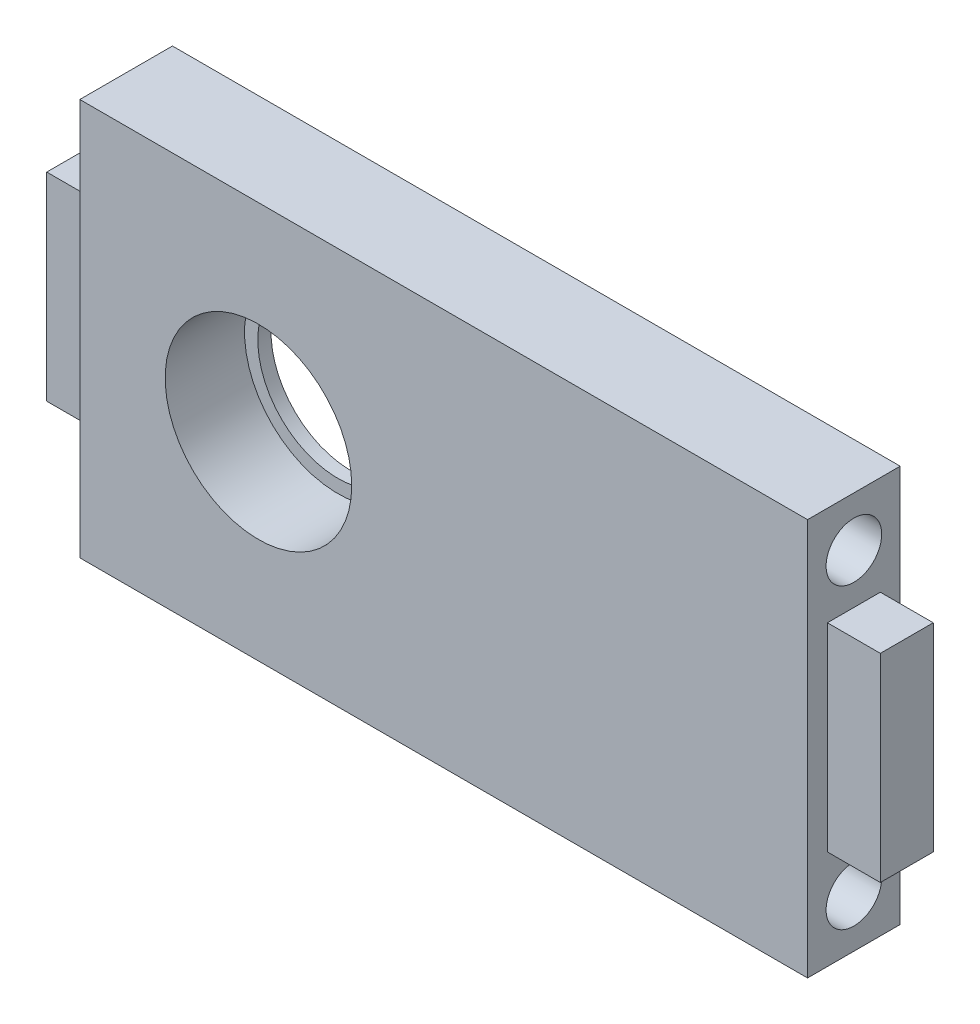
ISO-10303-21;
HEADER;
FILE_DESCRIPTION(('STEP AP214'),'2;1');
FILE_NAME('part.step','',(''),(''),'','','');
FILE_SCHEMA(('AUTOMOTIVE_DESIGN { 1 0 10303 214 1 1 1 1 }'));
ENDSEC;
DATA;
#1=APPLICATION_CONTEXT('core data for automotive mechanical design processes');
#2=APPLICATION_PROTOCOL_DEFINITION('international standard','automotive_design',2000,#1);
#3=PRODUCT_CONTEXT('',#1,'mechanical');
#4=PRODUCT('Part','Part','',(#3));
#5=PRODUCT_RELATED_PRODUCT_CATEGORY('part','',(#4));
#6=PRODUCT_DEFINITION_FORMATION('','',#4);
#7=PRODUCT_DEFINITION_CONTEXT('part definition',#1,'design');
#8=PRODUCT_DEFINITION('design','',#6,#7);
#9=PRODUCT_DEFINITION_SHAPE('','',#8);
#10=(LENGTH_UNIT() NAMED_UNIT(*) SI_UNIT(.MILLI.,.METRE.));
#11=(NAMED_UNIT(*) PLANE_ANGLE_UNIT() SI_UNIT($,.RADIAN.));
#12=(NAMED_UNIT(*) SI_UNIT($,.STERADIAN.) SOLID_ANGLE_UNIT());
#13=UNCERTAINTY_MEASURE_WITH_UNIT(LENGTH_MEASURE(1.E-05),#10,'distance_accuracy_value','');
#14=(GEOMETRIC_REPRESENTATION_CONTEXT(3) GLOBAL_UNCERTAINTY_ASSIGNED_CONTEXT((#13)) GLOBAL_UNIT_ASSIGNED_CONTEXT((#10,
#11,#12)) REPRESENTATION_CONTEXT('',''));
#15=CARTESIAN_POINT('',(0.,0.,0.));
#16=DIRECTION('',(0.,0.,1.));
#17=DIRECTION('',(1.,0.,0.));
#18=AXIS2_PLACEMENT_3D('',#15,#16,#17);
#19=CARTESIAN_POINT('',(0.,0.,7.));
#20=DIRECTION('',(0.,0.,-1.));
#21=DIRECTION('',(-1.,0.,0.));
#22=AXIS2_PLACEMENT_3D('',#19,#20,#21);
#23=PLANE('',#22);
#24=DIRECTION('',(0.,1.,0.));
#25=VECTOR('',#24,1.);
#26=CARTESIAN_POINT('',(27.5,-15.,7.));
#27=LINE('',#26,#25);
#28=CARTESIAN_POINT('',(27.5,-15.,7.));
#29=VERTEX_POINT('',#28);
#30=CARTESIAN_POINT('',(27.5,15.,7.));
#31=VERTEX_POINT('',#30);
#32=EDGE_CURVE('E192',#29,#31,#27,.T.);
#33=ORIENTED_EDGE('',*,*,#32,.T.);
#34=DIRECTION('',(-1.,0.,0.));
#35=VECTOR('',#34,1.);
#36=CARTESIAN_POINT('',(-27.5,15.,7.));
#37=LINE('',#36,#35);
#38=CARTESIAN_POINT('',(-27.5,15.,7.));
#39=VERTEX_POINT('',#38);
#40=EDGE_CURVE('E195',#31,#39,#37,.T.);
#41=ORIENTED_EDGE('',*,*,#40,.T.);
#42=DIRECTION('',(0.,-1.,0.));
#43=VECTOR('',#42,1.);
#44=CARTESIAN_POINT('',(-27.5,-15.,7.));
#45=LINE('',#44,#43);
#46=CARTESIAN_POINT('',(-27.5,-15.,7.));
#47=VERTEX_POINT('',#46);
#48=EDGE_CURVE('E198',#39,#47,#45,.T.);
#49=ORIENTED_EDGE('',*,*,#48,.T.);
#50=DIRECTION('',(1.,0.,0.));
#51=VECTOR('',#50,1.);
#52=CARTESIAN_POINT('',(-27.5,-15.,7.));
#53=LINE('',#52,#51);
#54=EDGE_CURVE('E200',#47,#29,#53,.T.);
#55=ORIENTED_EDGE('',*,*,#54,.T.);
#56=EDGE_LOOP('',(#33,#41,#49,#55));
#57=FACE_BOUND('',#56,.T.);
#58=CARTESIAN_POINT('',(-14.,0.,7.));
#59=DIRECTION('',(0.,0.,1.));
#60=DIRECTION('',(1.,0.,0.));
#61=AXIS2_PLACEMENT_3D('',#58,#59,#60);
#62=CIRCLE('',#61,7.05);
#63=CARTESIAN_POINT('',(-6.95,0.,7.));
#64=VERTEX_POINT('',#63);
#65=EDGE_CURVE('E186',#64,#64,#62,.T.);
#66=ORIENTED_EDGE('',*,*,#65,.F.);
#67=EDGE_LOOP('',(#66));
#68=FACE_BOUND('',#67,.T.);
#69=ADVANCED_FACE('F35',(#57,#68),#23,.F.);
#70=CARTESIAN_POINT('',(0.,0.,0.));
#71=DIRECTION('',(0.,0.,-1.));
#72=DIRECTION('',(-1.,0.,0.));
#73=AXIS2_PLACEMENT_3D('',#70,#71,#72);
#74=PLANE('',#73);
#75=DIRECTION('',(0.,1.,0.));
#76=VECTOR('',#75,1.);
#77=CARTESIAN_POINT('',(27.5,-15.,0.));
#78=LINE('',#77,#76);
#79=CARTESIAN_POINT('',(27.5,-15.,0.));
#80=VERTEX_POINT('',#79);
#81=CARTESIAN_POINT('',(27.5,15.,0.));
#82=VERTEX_POINT('',#81);
#83=EDGE_CURVE('E191',#80,#82,#78,.T.);
#84=ORIENTED_EDGE('',*,*,#83,.F.);
#85=DIRECTION('',(1.,0.,0.));
#86=VECTOR('',#85,1.);
#87=CARTESIAN_POINT('',(-27.5,-15.,0.));
#88=LINE('',#87,#86);
#89=CARTESIAN_POINT('',(-27.5,-15.,0.));
#90=VERTEX_POINT('',#89);
#91=EDGE_CURVE('E196',#90,#80,#88,.T.);
#92=ORIENTED_EDGE('',*,*,#91,.F.);
#93=DIRECTION('',(0.,-1.,0.));
#94=VECTOR('',#93,1.);
#95=CARTESIAN_POINT('',(-27.5,-15.,0.));
#96=LINE('',#95,#94);
#97=CARTESIAN_POINT('',(-27.5,15.,0.));
#98=VERTEX_POINT('',#97);
#99=EDGE_CURVE('E207',#98,#90,#96,.T.);
#100=ORIENTED_EDGE('',*,*,#99,.F.);
#101=DIRECTION('',(-1.,0.,0.));
#102=VECTOR('',#101,1.);
#103=CARTESIAN_POINT('',(-27.5,15.,0.));
#104=LINE('',#103,#102);
#105=EDGE_CURVE('E205',#82,#98,#104,.T.);
#106=ORIENTED_EDGE('',*,*,#105,.F.);
#107=EDGE_LOOP('',(#84,#92,#100,#106));
#108=FACE_BOUND('',#107,.T.);
#109=CARTESIAN_POINT('',(-14.,0.,0.));
#110=DIRECTION('',(0.,0.,1.));
#111=DIRECTION('',(1.,0.,0.));
#112=AXIS2_PLACEMENT_3D('',#109,#110,#111);
#113=CIRCLE('',#112,6.05);
#114=CARTESIAN_POINT('',(-7.95,0.,0.));
#115=VERTEX_POINT('',#114);
#116=EDGE_CURVE('E182',#115,#115,#113,.T.);
#117=ORIENTED_EDGE('',*,*,#116,.T.);
#118=EDGE_LOOP('',(#117));
#119=FACE_BOUND('',#118,.T.);
#120=ADVANCED_FACE('F228',(#108,#119),#74,.T.);
#121=CARTESIAN_POINT('',(27.5,-15.,7.));
#122=DIRECTION('',(-1.,0.,0.));
#123=DIRECTION('',(0.,0.,1.));
#124=AXIS2_PLACEMENT_3D('',#121,#122,#123);
#125=PLANE('',#124);
#126=CARTESIAN_POINT('',(27.5,11.25,3.5));
#127=DIRECTION('',(1.,0.,0.));
#128=DIRECTION('',(0.,0.,-1.));
#129=AXIS2_PLACEMENT_3D('',#126,#127,#128);
#130=CIRCLE('',#129,2.1);
#131=CARTESIAN_POINT('',(27.5,11.25,1.4));
#132=VERTEX_POINT('',#131);
#133=EDGE_CURVE('E274',#132,#132,#130,.T.);
#134=ORIENTED_EDGE('',*,*,#133,.F.);
#135=EDGE_LOOP('',(#134));
#136=FACE_BOUND('',#135,.T.);
#137=CARTESIAN_POINT('',(27.5,-11.25,3.5));
#138=DIRECTION('',(1.,0.,0.));
#139=DIRECTION('',(0.,0.,1.));
#140=AXIS2_PLACEMENT_3D('',#137,#138,#139);
#141=CIRCLE('',#140,2.1);
#142=CARTESIAN_POINT('',(27.5,-11.25,5.6));
#143=VERTEX_POINT('',#142);
#144=EDGE_CURVE('E278',#143,#143,#141,.T.);
#145=ORIENTED_EDGE('',*,*,#144,.F.);
#146=EDGE_LOOP('',(#145));
#147=FACE_BOUND('',#146,.T.);
#148=DIRECTION('',(0.,0.,-1.));
#149=VECTOR('',#148,1.);
#150=CARTESIAN_POINT('',(27.5,7.49999999999999,5.5));
#151=LINE('',#150,#149);
#152=CARTESIAN_POINT('',(27.5,7.49999999999999,5.5));
#153=VERTEX_POINT('',#152);
#154=CARTESIAN_POINT('',(27.5,7.49999999999999,1.5));
#155=VERTEX_POINT('',#154);
#156=EDGE_CURVE('E165',#153,#155,#151,.T.);
#157=ORIENTED_EDGE('',*,*,#156,.T.);
#158=DIRECTION('',(0.,-1.,0.));
#159=VECTOR('',#158,1.);
#160=CARTESIAN_POINT('',(27.5,7.49999999999999,1.5));
#161=LINE('',#160,#159);
#162=CARTESIAN_POINT('',(27.5,-7.49999999999999,1.5));
#163=VERTEX_POINT('',#162);
#164=EDGE_CURVE('E58',#155,#163,#161,.T.);
#165=ORIENTED_EDGE('',*,*,#164,.T.);
#166=DIRECTION('',(0.,0.,-1.));
#167=VECTOR('',#166,1.);
#168=CARTESIAN_POINT('',(27.5,-7.49999999999999,5.5));
#169=LINE('',#168,#167);
#170=CARTESIAN_POINT('',(27.5,-7.49999999999999,5.5));
#171=VERTEX_POINT('',#170);
#172=EDGE_CURVE('E179',#171,#163,#169,.T.);
#173=ORIENTED_EDGE('',*,*,#172,.F.);
#174=DIRECTION('',(0.,-1.,0.));
#175=VECTOR('',#174,1.);
#176=CARTESIAN_POINT('',(27.5,7.49999999999999,5.5));
#177=LINE('',#176,#175);
#178=EDGE_CURVE('E156',#153,#171,#177,.T.);
#179=ORIENTED_EDGE('',*,*,#178,.F.);
#180=EDGE_LOOP('',(#157,#165,#173,#179));
#181=FACE_BOUND('',#180,.T.);
#182=ORIENTED_EDGE('',*,*,#83,.T.);
#183=DIRECTION('',(0.,0.,-1.));
#184=VECTOR('',#183,1.);
#185=CARTESIAN_POINT('',(27.5,15.,7.));
#186=LINE('',#185,#184);
#187=EDGE_CURVE('E43',#31,#82,#186,.T.);
#188=ORIENTED_EDGE('',*,*,#187,.F.);
#189=ORIENTED_EDGE('',*,*,#32,.F.);
#190=DIRECTION('',(0.,0.,-1.));
#191=VECTOR('',#190,1.);
#192=CARTESIAN_POINT('',(27.5,-15.,7.));
#193=LINE('',#192,#191);
#194=EDGE_CURVE('E202',#29,#80,#193,.T.);
#195=ORIENTED_EDGE('',*,*,#194,.T.);
#196=EDGE_LOOP('',(#182,#188,#189,#195));
#197=FACE_BOUND('',#196,.T.);
#198=ADVANCED_FACE('F37',(#136,#147,#181,#197),#125,.F.);
#199=CARTESIAN_POINT('',(-27.5,15.,7.));
#200=DIRECTION('',(0.,-1.,0.));
#201=DIRECTION('',(0.,0.,-1.));
#202=AXIS2_PLACEMENT_3D('',#199,#200,#201);
#203=PLANE('',#202);
#204=ORIENTED_EDGE('',*,*,#105,.T.);
#205=DIRECTION('',(0.,0.,-1.));
#206=VECTOR('',#205,1.);
#207=CARTESIAN_POINT('',(-27.5,15.,7.));
#208=LINE('',#207,#206);
#209=EDGE_CURVE('E215',#39,#98,#208,.T.);
#210=ORIENTED_EDGE('',*,*,#209,.F.);
#211=ORIENTED_EDGE('',*,*,#40,.F.);
#212=ORIENTED_EDGE('',*,*,#187,.T.);
#213=EDGE_LOOP('',(#204,#210,#211,#212));
#214=FACE_BOUND('',#213,.T.);
#215=ADVANCED_FACE('F220',(#214),#203,.F.);
#216=CARTESIAN_POINT('',(-27.5,-15.,7.));
#217=DIRECTION('',(1.,0.,0.));
#218=DIRECTION('',(0.,0.,-1.));
#219=AXIS2_PLACEMENT_3D('',#216,#217,#218);
#220=PLANE('',#219);
#221=CARTESIAN_POINT('',(-27.5,11.25,3.5));
#222=DIRECTION('',(1.,0.,0.));
#223=DIRECTION('',(0.,0.,-1.));
#224=AXIS2_PLACEMENT_3D('',#221,#222,#223);
#225=CIRCLE('',#224,2.1);
#226=CARTESIAN_POINT('',(-27.5,11.25,1.4));
#227=VERTEX_POINT('',#226);
#228=EDGE_CURVE('E483',#227,#227,#225,.T.);
#229=ORIENTED_EDGE('',*,*,#228,.T.);
#230=EDGE_LOOP('',(#229));
#231=FACE_BOUND('',#230,.T.);
#232=CARTESIAN_POINT('',(-27.5,-11.25,3.5));
#233=DIRECTION('',(1.,0.,0.));
#234=DIRECTION('',(0.,0.,1.));
#235=AXIS2_PLACEMENT_3D('',#232,#233,#234);
#236=CIRCLE('',#235,2.1);
#237=CARTESIAN_POINT('',(-27.5,-11.25,5.6));
#238=VERTEX_POINT('',#237);
#239=EDGE_CURVE('E493',#238,#238,#236,.T.);
#240=ORIENTED_EDGE('',*,*,#239,.T.);
#241=EDGE_LOOP('',(#240));
#242=FACE_BOUND('',#241,.T.);
#243=DIRECTION('',(0.,0.,-1.));
#244=VECTOR('',#243,1.);
#245=CARTESIAN_POINT('',(-27.5,-7.49999999999999,5.5));
#246=LINE('',#245,#244);
#247=CARTESIAN_POINT('',(-27.5,-7.49999999999999,5.5));
#248=VERTEX_POINT('',#247);
#249=CARTESIAN_POINT('',(-27.5,-7.49999999999999,1.5));
#250=VERTEX_POINT('',#249);
#251=EDGE_CURVE('E152',#248,#250,#246,.T.);
#252=ORIENTED_EDGE('',*,*,#251,.T.);
#253=DIRECTION('',(0.,1.,0.));
#254=VECTOR('',#253,1.);
#255=CARTESIAN_POINT('',(-27.5,7.49999999999999,1.5));
#256=LINE('',#255,#254);
#257=CARTESIAN_POINT('',(-27.5,7.49999999999999,1.5));
#258=VERTEX_POINT('',#257);
#259=EDGE_CURVE('E50',#250,#258,#256,.T.);
#260=ORIENTED_EDGE('',*,*,#259,.T.);
#261=DIRECTION('',(0.,0.,-1.));
#262=VECTOR('',#261,1.);
#263=CARTESIAN_POINT('',(-27.5,7.49999999999999,5.5));
#264=LINE('',#263,#262);
#265=CARTESIAN_POINT('',(-27.5,7.49999999999999,5.5));
#266=VERTEX_POINT('',#265);
#267=EDGE_CURVE('E504',#266,#258,#264,.T.);
#268=ORIENTED_EDGE('',*,*,#267,.F.);
#269=DIRECTION('',(0.,1.,0.));
#270=VECTOR('',#269,1.);
#271=CARTESIAN_POINT('',(-27.5,7.49999999999999,5.5));
#272=LINE('',#271,#270);
#273=EDGE_CURVE('E143',#248,#266,#272,.T.);
#274=ORIENTED_EDGE('',*,*,#273,.F.);
#275=EDGE_LOOP('',(#252,#260,#268,#274));
#276=FACE_BOUND('',#275,.T.);
#277=ORIENTED_EDGE('',*,*,#99,.T.);
#278=DIRECTION('',(0.,0.,-1.));
#279=VECTOR('',#278,1.);
#280=CARTESIAN_POINT('',(-27.5,-15.,7.));
#281=LINE('',#280,#279);
#282=EDGE_CURVE('E212',#47,#90,#281,.T.);
#283=ORIENTED_EDGE('',*,*,#282,.F.);
#284=ORIENTED_EDGE('',*,*,#48,.F.);
#285=ORIENTED_EDGE('',*,*,#209,.T.);
#286=EDGE_LOOP('',(#277,#283,#284,#285));
#287=FACE_BOUND('',#286,.T.);
#288=ADVANCED_FACE('F233',(#231,#242,#276,#287),#220,.F.);
#289=CARTESIAN_POINT('',(-27.5,-15.,7.));
#290=DIRECTION('',(0.,1.,0.));
#291=DIRECTION('',(0.,0.,1.));
#292=AXIS2_PLACEMENT_3D('',#289,#290,#291);
#293=PLANE('',#292);
#294=ORIENTED_EDGE('',*,*,#91,.T.);
#295=ORIENTED_EDGE('',*,*,#194,.F.);
#296=ORIENTED_EDGE('',*,*,#54,.F.);
#297=ORIENTED_EDGE('',*,*,#282,.T.);
#298=EDGE_LOOP('',(#294,#295,#296,#297));
#299=FACE_BOUND('',#298,.T.);
#300=ADVANCED_FACE('F237',(#299),#293,.F.);
#301=CARTESIAN_POINT('',(-14.,0.,7.));
#302=DIRECTION('',(0.,0.,-1.));
#303=DIRECTION('',(-1.,0.,0.));
#304=AXIS2_PLACEMENT_3D('',#301,#302,#303);
#305=CYLINDRICAL_SURFACE('',#304,7.05);
#306=CARTESIAN_POINT('',(-14.,0.,1.));
#307=DIRECTION('',(0.,0.,1.));
#308=DIRECTION('',(1.,0.,0.));
#309=AXIS2_PLACEMENT_3D('',#306,#307,#308);
#310=CIRCLE('',#309,7.05);
#311=CARTESIAN_POINT('',(-6.95,0.,1.));
#312=VERTEX_POINT('',#311);
#313=EDGE_CURVE('E11',#312,#312,#310,.T.);
#314=ORIENTED_EDGE('',*,*,#313,.F.);
#315=EDGE_LOOP('',(#314));
#316=FACE_BOUND('',#315,.T.);
#317=ORIENTED_EDGE('',*,*,#65,.T.);
#318=EDGE_LOOP('',(#317));
#319=FACE_BOUND('',#318,.T.);
#320=ADVANCED_FACE('F244',(#316,#319),#305,.F.);
#321=CARTESIAN_POINT('',(-14.,0.,1.));
#322=DIRECTION('',(0.,0.,1.));
#323=DIRECTION('',(1.,0.,0.));
#324=AXIS2_PLACEMENT_3D('',#321,#322,#323);
#325=PLANE('',#324);
#326=ORIENTED_EDGE('',*,*,#313,.T.);
#327=EDGE_LOOP('',(#326));
#328=FACE_BOUND('',#327,.T.);
#329=CARTESIAN_POINT('',(-14.,0.,1.));
#330=DIRECTION('',(0.,0.,1.));
#331=DIRECTION('',(1.,0.,0.));
#332=AXIS2_PLACEMENT_3D('',#329,#330,#331);
#333=CIRCLE('',#332,6.05);
#334=CARTESIAN_POINT('',(-7.95,0.,1.));
#335=VERTEX_POINT('',#334);
#336=EDGE_CURVE('E183',#335,#335,#333,.T.);
#337=ORIENTED_EDGE('',*,*,#336,.F.);
#338=EDGE_LOOP('',(#337));
#339=FACE_BOUND('',#338,.T.);
#340=ADVANCED_FACE('F246',(#328,#339),#325,.T.);
#341=CARTESIAN_POINT('',(-14.,0.,1.));
#342=DIRECTION('',(0.,0.,-1.));
#343=DIRECTION('',(-1.,0.,0.));
#344=AXIS2_PLACEMENT_3D('',#341,#342,#343);
#345=CYLINDRICAL_SURFACE('',#344,6.05);
#346=ORIENTED_EDGE('',*,*,#336,.T.);
#347=EDGE_LOOP('',(#346));
#348=FACE_BOUND('',#347,.T.);
#349=ORIENTED_EDGE('',*,*,#116,.F.);
#350=EDGE_LOOP('',(#349));
#351=FACE_BOUND('',#350,.T.);
#352=ADVANCED_FACE('F253',(#348,#351),#345,.F.);
#353=CARTESIAN_POINT('',(27.5,-7.49999999999999,5.5));
#354=DIRECTION('',(0.,1.,0.));
#355=DIRECTION('',(-1.,0.,0.));
#356=AXIS2_PLACEMENT_3D('',#353,#354,#355);
#357=PLANE('',#356);
#358=DIRECTION('',(1.,0.,0.));
#359=VECTOR('',#358,1.);
#360=CARTESIAN_POINT('',(27.5,-7.49999999999999,1.5));
#361=LINE('',#360,#359);
#362=CARTESIAN_POINT('',(31.5,-7.50000000000001,1.5));
#363=VERTEX_POINT('',#362);
#364=EDGE_CURVE('E150',#163,#363,#361,.T.);
#365=ORIENTED_EDGE('',*,*,#364,.T.);
#366=DIRECTION('',(0.,0.,-1.));
#367=VECTOR('',#366,1.);
#368=CARTESIAN_POINT('',(31.5,-7.50000000000001,5.5));
#369=LINE('',#368,#367);
#370=CARTESIAN_POINT('',(31.5,-7.50000000000001,5.5));
#371=VERTEX_POINT('',#370);
#372=EDGE_CURVE('E176',#371,#363,#369,.T.);
#373=ORIENTED_EDGE('',*,*,#372,.F.);
#374=DIRECTION('',(1.,0.,0.));
#375=VECTOR('',#374,1.);
#376=CARTESIAN_POINT('',(27.5,-7.49999999999999,5.5));
#377=LINE('',#376,#375);
#378=EDGE_CURVE('E159',#171,#371,#377,.T.);
#379=ORIENTED_EDGE('',*,*,#378,.F.);
#380=ORIENTED_EDGE('',*,*,#172,.T.);
#381=EDGE_LOOP('',(#365,#373,#379,#380));
#382=FACE_BOUND('',#381,.T.);
#383=ADVANCED_FACE('F293',(#382),#357,.F.);
#384=CARTESIAN_POINT('',(31.5,7.49999999999999,5.5));
#385=DIRECTION('',(-1.,0.,0.));
#386=DIRECTION('',(0.,0.,1.));
#387=AXIS2_PLACEMENT_3D('',#384,#385,#386);
#388=PLANE('',#387);
#389=DIRECTION('',(0.,1.,0.));
#390=VECTOR('',#389,1.);
#391=CARTESIAN_POINT('',(31.5,7.49999999999999,1.5));
#392=LINE('',#391,#390);
#393=CARTESIAN_POINT('',(31.5,7.49999999999999,1.5));
#394=VERTEX_POINT('',#393);
#395=EDGE_CURVE('E168',#363,#394,#392,.T.);
#396=ORIENTED_EDGE('',*,*,#395,.T.);
#397=DIRECTION('',(0.,0.,-1.));
#398=VECTOR('',#397,1.);
#399=CARTESIAN_POINT('',(31.5,7.49999999999999,5.5));
#400=LINE('',#399,#398);
#401=CARTESIAN_POINT('',(31.5,7.49999999999999,5.5));
#402=VERTEX_POINT('',#401);
#403=EDGE_CURVE('E173',#402,#394,#400,.T.);
#404=ORIENTED_EDGE('',*,*,#403,.F.);
#405=DIRECTION('',(0.,1.,0.));
#406=VECTOR('',#405,1.);
#407=CARTESIAN_POINT('',(31.5,7.49999999999999,5.5));
#408=LINE('',#407,#406);
#409=EDGE_CURVE('E162',#371,#402,#408,.T.);
#410=ORIENTED_EDGE('',*,*,#409,.F.);
#411=ORIENTED_EDGE('',*,*,#372,.T.);
#412=EDGE_LOOP('',(#396,#404,#410,#411));
#413=FACE_BOUND('',#412,.T.);
#414=ADVANCED_FACE('F289',(#413),#388,.F.);
#415=CARTESIAN_POINT('',(27.5,7.49999999999999,5.5));
#416=DIRECTION('',(0.,-1.,0.));
#417=DIRECTION('',(0.,0.,-1.));
#418=AXIS2_PLACEMENT_3D('',#415,#416,#417);
#419=PLANE('',#418);
#420=DIRECTION('',(-1.,0.,0.));
#421=VECTOR('',#420,1.);
#422=CARTESIAN_POINT('',(27.5,7.49999999999999,1.5));
#423=LINE('',#422,#421);
#424=EDGE_CURVE('E160',#394,#155,#423,.T.);
#425=ORIENTED_EDGE('',*,*,#424,.T.);
#426=ORIENTED_EDGE('',*,*,#156,.F.);
#427=DIRECTION('',(-1.,0.,0.));
#428=VECTOR('',#427,1.);
#429=CARTESIAN_POINT('',(27.5,7.49999999999999,5.5));
#430=LINE('',#429,#428);
#431=EDGE_CURVE('E164',#402,#153,#430,.T.);
#432=ORIENTED_EDGE('',*,*,#431,.F.);
#433=ORIENTED_EDGE('',*,*,#403,.T.);
#434=EDGE_LOOP('',(#425,#426,#432,#433));
#435=FACE_BOUND('',#434,.T.);
#436=ADVANCED_FACE('F284',(#435),#419,.F.);
#437=CARTESIAN_POINT('',(0.,0.,5.5));
#438=DIRECTION('',(0.,0.,1.));
#439=DIRECTION('',(1.,0.,0.));
#440=AXIS2_PLACEMENT_3D('',#437,#438,#439);
#441=PLANE('',#440);
#442=ORIENTED_EDGE('',*,*,#178,.T.);
#443=ORIENTED_EDGE('',*,*,#378,.T.);
#444=ORIENTED_EDGE('',*,*,#409,.T.);
#445=ORIENTED_EDGE('',*,*,#431,.T.);
#446=EDGE_LOOP('',(#442,#443,#444,#445));
#447=FACE_BOUND('',#446,.T.);
#448=ADVANCED_FACE('F295',(#447),#441,.T.);
#449=CARTESIAN_POINT('',(0.,0.,1.5));
#450=DIRECTION('',(0.,0.,1.));
#451=DIRECTION('',(1.,0.,0.));
#452=AXIS2_PLACEMENT_3D('',#449,#450,#451);
#453=PLANE('',#452);
#454=ORIENTED_EDGE('',*,*,#164,.F.);
#455=ORIENTED_EDGE('',*,*,#424,.F.);
#456=ORIENTED_EDGE('',*,*,#395,.F.);
#457=ORIENTED_EDGE('',*,*,#364,.F.);
#458=EDGE_LOOP('',(#454,#455,#456,#457));
#459=FACE_BOUND('',#458,.T.);
#460=ADVANCED_FACE('F287',(#459),#453,.F.);
#461=CARTESIAN_POINT('',(-27.5,7.49999999999999,5.5));
#462=DIRECTION('',(0.,-1.,0.));
#463=DIRECTION('',(1.,0.,0.));
#464=AXIS2_PLACEMENT_3D('',#461,#462,#463);
#465=PLANE('',#464);
#466=DIRECTION('',(-1.,0.,0.));
#467=VECTOR('',#466,1.);
#468=CARTESIAN_POINT('',(-27.5,7.49999999999999,1.5));
#469=LINE('',#468,#467);
#470=CARTESIAN_POINT('',(-31.5,7.50000000000001,1.5));
#471=VERTEX_POINT('',#470);
#472=EDGE_CURVE('E148',#258,#471,#469,.T.);
#473=ORIENTED_EDGE('',*,*,#472,.T.);
#474=DIRECTION('',(0.,0.,-1.));
#475=VECTOR('',#474,1.);
#476=CARTESIAN_POINT('',(-31.5,7.50000000000001,5.5));
#477=LINE('',#476,#475);
#478=CARTESIAN_POINT('',(-31.5,7.50000000000001,5.5));
#479=VERTEX_POINT('',#478);
#480=EDGE_CURVE('E131',#479,#471,#477,.T.);
#481=ORIENTED_EDGE('',*,*,#480,.F.);
#482=DIRECTION('',(-1.,0.,0.));
#483=VECTOR('',#482,1.);
#484=CARTESIAN_POINT('',(-27.5,7.49999999999999,5.5));
#485=LINE('',#484,#483);
#486=EDGE_CURVE('E138',#266,#479,#485,.T.);
#487=ORIENTED_EDGE('',*,*,#486,.F.);
#488=ORIENTED_EDGE('',*,*,#267,.T.);
#489=EDGE_LOOP('',(#473,#481,#487,#488));
#490=FACE_BOUND('',#489,.T.);
#491=ADVANCED_FACE('F147',(#490),#465,.F.);
#492=CARTESIAN_POINT('',(-31.5,7.50000000000001,5.5));
#493=DIRECTION('',(1.,0.,0.));
#494=DIRECTION('',(0.,0.,-1.));
#495=AXIS2_PLACEMENT_3D('',#492,#493,#494);
#496=PLANE('',#495);
#497=DIRECTION('',(0.,-1.,0.));
#498=VECTOR('',#497,1.);
#499=CARTESIAN_POINT('',(-31.5,7.50000000000001,1.5));
#500=LINE('',#499,#498);
#501=CARTESIAN_POINT('',(-31.5,-7.50000000000001,1.5));
#502=VERTEX_POINT('',#501);
#503=EDGE_CURVE('E506',#471,#502,#500,.T.);
#504=ORIENTED_EDGE('',*,*,#503,.T.);
#505=DIRECTION('',(0.,0.,-1.));
#506=VECTOR('',#505,1.);
#507=CARTESIAN_POINT('',(-31.5,-7.50000000000001,5.5));
#508=LINE('',#507,#506);
#509=CARTESIAN_POINT('',(-31.5,-7.50000000000001,5.5));
#510=VERTEX_POINT('',#509);
#511=EDGE_CURVE('E134',#510,#502,#508,.T.);
#512=ORIENTED_EDGE('',*,*,#511,.F.);
#513=DIRECTION('',(0.,-1.,0.));
#514=VECTOR('',#513,1.);
#515=CARTESIAN_POINT('',(-31.5,7.50000000000001,5.5));
#516=LINE('',#515,#514);
#517=EDGE_CURVE('E127',#479,#510,#516,.T.);
#518=ORIENTED_EDGE('',*,*,#517,.F.);
#519=ORIENTED_EDGE('',*,*,#480,.T.);
#520=EDGE_LOOP('',(#504,#512,#518,#519));
#521=FACE_BOUND('',#520,.T.);
#522=ADVANCED_FACE('F129',(#521),#496,.F.);
#523=CARTESIAN_POINT('',(-27.5,-7.49999999999999,5.5));
#524=DIRECTION('',(0.,1.,0.));
#525=DIRECTION('',(-1.,0.,0.));
#526=AXIS2_PLACEMENT_3D('',#523,#524,#525);
#527=PLANE('',#526);
#528=DIRECTION('',(1.,0.,0.));
#529=VECTOR('',#528,1.);
#530=CARTESIAN_POINT('',(-27.5,-7.49999999999999,1.5));
#531=LINE('',#530,#529);
#532=EDGE_CURVE('E508',#502,#250,#531,.T.);
#533=ORIENTED_EDGE('',*,*,#532,.T.);
#534=ORIENTED_EDGE('',*,*,#251,.F.);
#535=DIRECTION('',(1.,0.,0.));
#536=VECTOR('',#535,1.);
#537=CARTESIAN_POINT('',(-27.5,-7.49999999999999,5.5));
#538=LINE('',#537,#536);
#539=EDGE_CURVE('E137',#510,#248,#538,.T.);
#540=ORIENTED_EDGE('',*,*,#539,.F.);
#541=ORIENTED_EDGE('',*,*,#511,.T.);
#542=EDGE_LOOP('',(#533,#534,#540,#541));
#543=FACE_BOUND('',#542,.T.);
#544=ADVANCED_FACE('F358',(#543),#527,.F.);
#545=CARTESIAN_POINT('',(0.,0.,5.5));
#546=DIRECTION('',(0.,0.,1.));
#547=DIRECTION('',(1.,0.,0.));
#548=AXIS2_PLACEMENT_3D('',#545,#546,#547);
#549=PLANE('',#548);
#550=ORIENTED_EDGE('',*,*,#486,.T.);
#551=ORIENTED_EDGE('',*,*,#517,.T.);
#552=ORIENTED_EDGE('',*,*,#539,.T.);
#553=ORIENTED_EDGE('',*,*,#273,.T.);
#554=EDGE_LOOP('',(#550,#551,#552,#553));
#555=FACE_BOUND('',#554,.T.);
#556=ADVANCED_FACE('F141',(#555),#549,.T.);
#557=CARTESIAN_POINT('',(0.,0.,1.5));
#558=DIRECTION('',(0.,0.,1.));
#559=DIRECTION('',(1.,0.,0.));
#560=AXIS2_PLACEMENT_3D('',#557,#558,#559);
#561=PLANE('',#560);
#562=ORIENTED_EDGE('',*,*,#472,.F.);
#563=ORIENTED_EDGE('',*,*,#259,.F.);
#564=ORIENTED_EDGE('',*,*,#532,.F.);
#565=ORIENTED_EDGE('',*,*,#503,.F.);
#566=EDGE_LOOP('',(#562,#563,#564,#565));
#567=FACE_BOUND('',#566,.T.);
#568=ADVANCED_FACE('F375',(#567),#561,.F.);
#569=CARTESIAN_POINT('',(21.5,-11.25,3.5));
#570=DIRECTION('',(1.,0.,0.));
#571=DIRECTION('',(0.,0.,-1.));
#572=AXIS2_PLACEMENT_3D('',#569,#570,#571);
#573=CYLINDRICAL_SURFACE('',#572,2.1);
#574=CARTESIAN_POINT('',(21.5,-11.25,3.5));
#575=DIRECTION('',(1.,0.,0.));
#576=DIRECTION('',(0.,0.,1.));
#577=AXIS2_PLACEMENT_3D('',#574,#575,#576);
#578=CIRCLE('',#577,2.1);
#579=CARTESIAN_POINT('',(21.5,-11.25,5.6));
#580=VERTEX_POINT('',#579);
#581=EDGE_CURVE('E485',#580,#580,#578,.T.);
#582=ORIENTED_EDGE('',*,*,#581,.F.);
#583=EDGE_LOOP('',(#582));
#584=FACE_BOUND('',#583,.T.);
#585=ORIENTED_EDGE('',*,*,#144,.T.);
#586=EDGE_LOOP('',(#585));
#587=FACE_BOUND('',#586,.T.);
#588=ADVANCED_FACE('F383',(#584,#587),#573,.F.);
#589=CARTESIAN_POINT('',(21.5,-11.25,3.5));
#590=DIRECTION('',(-1.,0.,0.));
#591=DIRECTION('',(0.,0.,1.));
#592=AXIS2_PLACEMENT_3D('',#589,#590,#591);
#593=PLANE('',#592);
#594=ORIENTED_EDGE('',*,*,#581,.T.);
#595=EDGE_LOOP('',(#594));
#596=FACE_BOUND('',#595,.T.);
#597=ADVANCED_FACE('F399',(#596),#593,.F.);
#598=CARTESIAN_POINT('',(21.5,11.25,3.5));
#599=DIRECTION('',(1.,0.,0.));
#600=DIRECTION('',(0.,0.,-1.));
#601=AXIS2_PLACEMENT_3D('',#598,#599,#600);
#602=CYLINDRICAL_SURFACE('',#601,2.1);
#603=CARTESIAN_POINT('',(21.5,11.25,3.5));
#604=DIRECTION('',(1.,0.,0.));
#605=DIRECTION('',(0.,0.,-1.));
#606=AXIS2_PLACEMENT_3D('',#603,#604,#605);
#607=CIRCLE('',#606,2.1);
#608=CARTESIAN_POINT('',(21.5,11.25,1.4));
#609=VERTEX_POINT('',#608);
#610=EDGE_CURVE('E496',#609,#609,#607,.T.);
#611=ORIENTED_EDGE('',*,*,#610,.F.);
#612=EDGE_LOOP('',(#611));
#613=FACE_BOUND('',#612,.T.);
#614=ORIENTED_EDGE('',*,*,#133,.T.);
#615=EDGE_LOOP('',(#614));
#616=FACE_BOUND('',#615,.T.);
#617=ADVANCED_FACE('F409',(#613,#616),#602,.F.);
#618=CARTESIAN_POINT('',(21.5,11.25,3.5));
#619=DIRECTION('',(1.,0.,0.));
#620=DIRECTION('',(0.,0.,-1.));
#621=AXIS2_PLACEMENT_3D('',#618,#619,#620);
#622=PLANE('',#621);
#623=ORIENTED_EDGE('',*,*,#610,.T.);
#624=EDGE_LOOP('',(#623));
#625=FACE_BOUND('',#624,.T.);
#626=ADVANCED_FACE('F419',(#625),#622,.T.);
#627=CARTESIAN_POINT('',(-21.5,-11.25,3.5));
#628=DIRECTION('',(-1.,0.,0.));
#629=DIRECTION('',(0.,0.,1.));
#630=AXIS2_PLACEMENT_3D('',#627,#628,#629);
#631=CYLINDRICAL_SURFACE('',#630,2.1);
#632=CARTESIAN_POINT('',(-21.5,-11.25,3.5));
#633=DIRECTION('',(1.,0.,0.));
#634=DIRECTION('',(0.,0.,1.));
#635=AXIS2_PLACEMENT_3D('',#632,#633,#634);
#636=CIRCLE('',#635,2.1);
#637=CARTESIAN_POINT('',(-21.5,-11.25,5.6));
#638=VERTEX_POINT('',#637);
#639=EDGE_CURVE('E488',#638,#638,#636,.T.);
#640=ORIENTED_EDGE('',*,*,#639,.T.);
#641=EDGE_LOOP('',(#640));
#642=FACE_BOUND('',#641,.T.);
#643=ORIENTED_EDGE('',*,*,#239,.F.);
#644=EDGE_LOOP('',(#643));
#645=FACE_BOUND('',#644,.T.);
#646=ADVANCED_FACE('F429',(#642,#645),#631,.F.);
#647=CARTESIAN_POINT('',(-21.5,-11.25,3.5));
#648=DIRECTION('',(1.,0.,0.));
#649=DIRECTION('',(0.,0.,1.));
#650=AXIS2_PLACEMENT_3D('',#647,#648,#649);
#651=PLANE('',#650);
#652=ORIENTED_EDGE('',*,*,#639,.F.);
#653=EDGE_LOOP('',(#652));
#654=FACE_BOUND('',#653,.T.);
#655=ADVANCED_FACE('F446',(#654),#651,.F.);
#656=CARTESIAN_POINT('',(-21.5,11.25,3.5));
#657=DIRECTION('',(-1.,0.,0.));
#658=DIRECTION('',(0.,0.,1.));
#659=AXIS2_PLACEMENT_3D('',#656,#657,#658);
#660=CYLINDRICAL_SURFACE('',#659,2.1);
#661=CARTESIAN_POINT('',(-21.5,11.25,3.5));
#662=DIRECTION('',(1.,0.,0.));
#663=DIRECTION('',(0.,0.,-1.));
#664=AXIS2_PLACEMENT_3D('',#661,#662,#663);
#665=CIRCLE('',#664,2.1);
#666=CARTESIAN_POINT('',(-21.5,11.25,1.4));
#667=VERTEX_POINT('',#666);
#668=EDGE_CURVE('E482',#667,#667,#665,.T.);
#669=ORIENTED_EDGE('',*,*,#668,.T.);
#670=EDGE_LOOP('',(#669));
#671=FACE_BOUND('',#670,.T.);
#672=ORIENTED_EDGE('',*,*,#228,.F.);
#673=EDGE_LOOP('',(#672));
#674=FACE_BOUND('',#673,.T.);
#675=ADVANCED_FACE('F456',(#671,#674),#660,.F.);
#676=CARTESIAN_POINT('',(-21.5,11.25,3.5));
#677=DIRECTION('',(-1.,0.,0.));
#678=DIRECTION('',(0.,0.,-1.));
#679=AXIS2_PLACEMENT_3D('',#676,#677,#678);
#680=PLANE('',#679);
#681=ORIENTED_EDGE('',*,*,#668,.F.);
#682=EDGE_LOOP('',(#681));
#683=FACE_BOUND('',#682,.T.);
#684=ADVANCED_FACE('F466',(#683),#680,.T.);
#685=CLOSED_SHELL('',(#69,#120,#198,#215,#288,#300,#320,#340,#352,#383,#414,#436,#448,#460,#491,
#522,#544,#556,#568,#588,#597,#617,#626,#646,#655,#675,#684));
#686=MANIFOLD_SOLID_BREP('B2',#685);
#687=ADVANCED_BREP_SHAPE_REPRESENTATION('',(#18,#686),#14);
#688=SHAPE_DEFINITION_REPRESENTATION(#9,#687);
ENDSEC;
END-ISO-10303-21;
